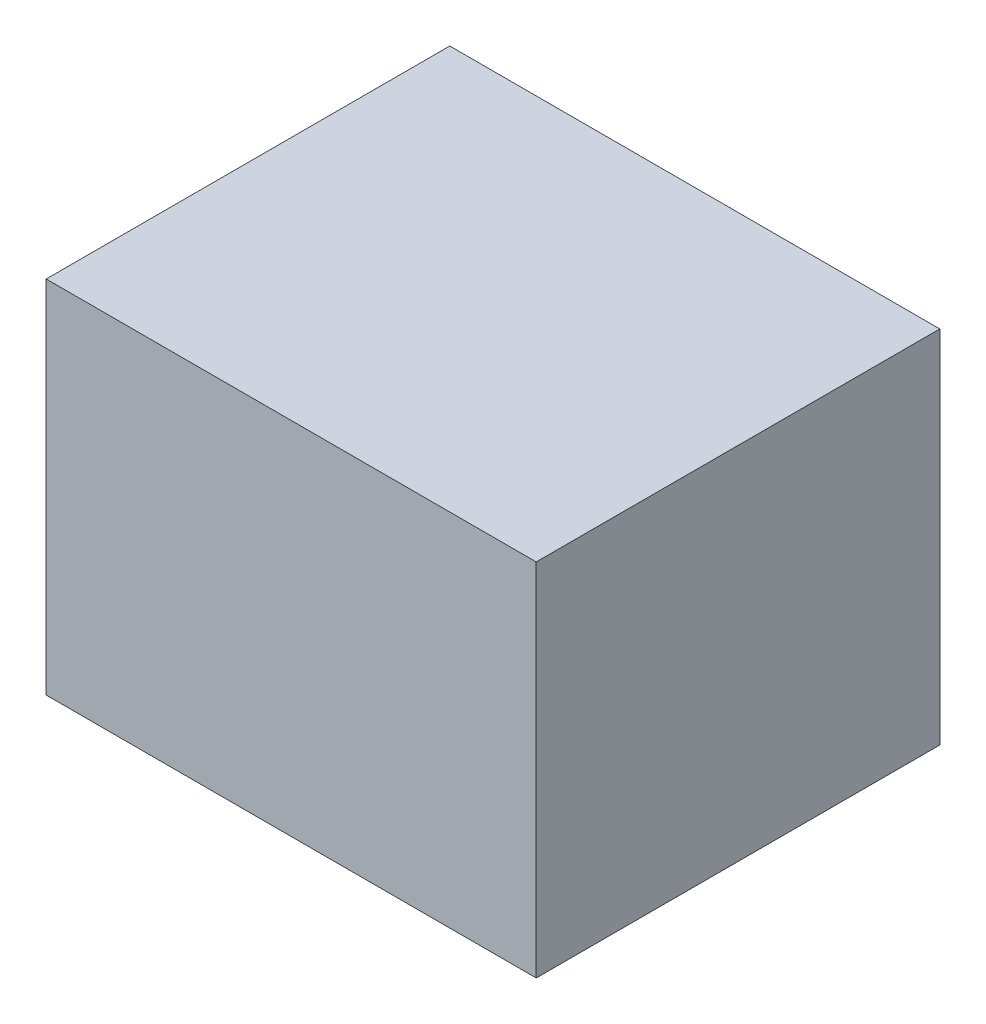
ISO-10303-21;
HEADER;
FILE_DESCRIPTION(('STEP AP214'),'2;1');
FILE_NAME('part.step','',(''),(''),'','','');
FILE_SCHEMA(('AUTOMOTIVE_DESIGN { 1 0 10303 214 1 1 1 1 }'));
ENDSEC;
DATA;
#1=APPLICATION_CONTEXT('core data for automotive mechanical design processes');
#2=APPLICATION_PROTOCOL_DEFINITION('international standard','automotive_design',2000,#1);
#3=PRODUCT_CONTEXT('',#1,'mechanical');
#4=PRODUCT('Part','Part','',(#3));
#5=PRODUCT_RELATED_PRODUCT_CATEGORY('part','',(#4));
#6=PRODUCT_DEFINITION_FORMATION('','',#4);
#7=PRODUCT_DEFINITION_CONTEXT('part definition',#1,'design');
#8=PRODUCT_DEFINITION('design','',#6,#7);
#9=PRODUCT_DEFINITION_SHAPE('','',#8);
#10=(LENGTH_UNIT() NAMED_UNIT(*) SI_UNIT(.MILLI.,.METRE.));
#11=(NAMED_UNIT(*) PLANE_ANGLE_UNIT() SI_UNIT($,.RADIAN.));
#12=(NAMED_UNIT(*) SI_UNIT($,.STERADIAN.) SOLID_ANGLE_UNIT());
#13=UNCERTAINTY_MEASURE_WITH_UNIT(LENGTH_MEASURE(1.E-05),#10,'distance_accuracy_value','');
#14=(GEOMETRIC_REPRESENTATION_CONTEXT(3) GLOBAL_UNCERTAINTY_ASSIGNED_CONTEXT((#13)) GLOBAL_UNIT_ASSIGNED_CONTEXT((#10,
#11,#12)) REPRESENTATION_CONTEXT('',''));
#15=CARTESIAN_POINT('',(0.,0.,0.));
#16=DIRECTION('',(0.,0.,1.));
#17=DIRECTION('',(1.,0.,0.));
#18=AXIS2_PLACEMENT_3D('',#15,#16,#17);
#19=CARTESIAN_POINT('',(170.,250.,-140.));
#20=DIRECTION('',(-1.,0.,0.));
#21=DIRECTION('',(0.,0.,1.));
#22=AXIS2_PLACEMENT_3D('',#19,#20,#21);
#23=PLANE('',#22);
#24=DIRECTION('',(0.,0.,-1.));
#25=VECTOR('',#24,1.);
#26=CARTESIAN_POINT('',(170.,0.,-140.));
#27=LINE('',#26,#25);
#28=CARTESIAN_POINT('',(170.,0.,140.));
#29=VERTEX_POINT('',#28);
#30=CARTESIAN_POINT('',(170.,0.,-140.));
#31=VERTEX_POINT('',#30);
#32=EDGE_CURVE('E97',#29,#31,#27,.T.);
#33=ORIENTED_EDGE('',*,*,#32,.T.);
#34=DIRECTION('',(0.,-1.,0.));
#35=VECTOR('',#34,1.);
#36=CARTESIAN_POINT('',(170.,250.,-140.));
#37=LINE('',#36,#35);
#38=CARTESIAN_POINT('',(170.,250.,-140.));
#39=VERTEX_POINT('',#38);
#40=EDGE_CURVE('E11',#39,#31,#37,.T.);
#41=ORIENTED_EDGE('',*,*,#40,.F.);
#42=DIRECTION('',(0.,0.,-1.));
#43=VECTOR('',#42,1.);
#44=CARTESIAN_POINT('',(170.,250.,-140.));
#45=LINE('',#44,#43);
#46=CARTESIAN_POINT('',(170.,250.,140.));
#47=VERTEX_POINT('',#46);
#48=EDGE_CURVE('E85',#47,#39,#45,.T.);
#49=ORIENTED_EDGE('',*,*,#48,.F.);
#50=DIRECTION('',(0.,-1.,0.));
#51=VECTOR('',#50,1.);
#52=CARTESIAN_POINT('',(170.,250.,140.));
#53=LINE('',#52,#51);
#54=EDGE_CURVE('E93',#47,#29,#53,.T.);
#55=ORIENTED_EDGE('',*,*,#54,.T.);
#56=EDGE_LOOP('',(#33,#41,#49,#55));
#57=FACE_BOUND('',#56,.T.);
#58=ADVANCED_FACE('F34',(#57),#23,.F.);
#59=CARTESIAN_POINT('',(-170.,250.,-140.));
#60=DIRECTION('',(0.,0.,1.));
#61=DIRECTION('',(1.,0.,0.));
#62=AXIS2_PLACEMENT_3D('',#59,#60,#61);
#63=PLANE('',#62);
#64=DIRECTION('',(-1.,0.,0.));
#65=VECTOR('',#64,1.);
#66=CARTESIAN_POINT('',(-170.,0.,-140.));
#67=LINE('',#66,#65);
#68=CARTESIAN_POINT('',(-170.,0.,-140.));
#69=VERTEX_POINT('',#68);
#70=EDGE_CURVE('E89',#31,#69,#67,.T.);
#71=ORIENTED_EDGE('',*,*,#70,.T.);
#72=DIRECTION('',(0.,-1.,0.));
#73=VECTOR('',#72,1.);
#74=CARTESIAN_POINT('',(-170.,250.,-140.));
#75=LINE('',#74,#73);
#76=CARTESIAN_POINT('',(-170.,250.,-140.));
#77=VERTEX_POINT('',#76);
#78=EDGE_CURVE('E42',#77,#69,#75,.T.);
#79=ORIENTED_EDGE('',*,*,#78,.F.);
#80=DIRECTION('',(-1.,0.,0.));
#81=VECTOR('',#80,1.);
#82=CARTESIAN_POINT('',(-170.,250.,-140.));
#83=LINE('',#82,#81);
#84=EDGE_CURVE('E80',#39,#77,#83,.T.);
#85=ORIENTED_EDGE('',*,*,#84,.F.);
#86=ORIENTED_EDGE('',*,*,#40,.T.);
#87=EDGE_LOOP('',(#71,#79,#85,#86));
#88=FACE_BOUND('',#87,.T.);
#89=ADVANCED_FACE('F88',(#88),#63,.F.);
#90=CARTESIAN_POINT('',(-170.,250.,-140.));
#91=DIRECTION('',(1.,0.,0.));
#92=DIRECTION('',(0.,0.,-1.));
#93=AXIS2_PLACEMENT_3D('',#90,#91,#92);
#94=PLANE('',#93);
#95=DIRECTION('',(0.,0.,1.));
#96=VECTOR('',#95,1.);
#97=CARTESIAN_POINT('',(-170.,0.,-140.));
#98=LINE('',#97,#96);
#99=CARTESIAN_POINT('',(-170.,0.,140.));
#100=VERTEX_POINT('',#99);
#101=EDGE_CURVE('E67',#69,#100,#98,.T.);
#102=ORIENTED_EDGE('',*,*,#101,.T.);
#103=DIRECTION('',(0.,-1.,0.));
#104=VECTOR('',#103,1.);
#105=CARTESIAN_POINT('',(-170.,250.,140.));
#106=LINE('',#105,#104);
#107=CARTESIAN_POINT('',(-170.,250.,140.));
#108=VERTEX_POINT('',#107);
#109=EDGE_CURVE('E90',#108,#100,#106,.T.);
#110=ORIENTED_EDGE('',*,*,#109,.F.);
#111=DIRECTION('',(0.,0.,1.));
#112=VECTOR('',#111,1.);
#113=CARTESIAN_POINT('',(-170.,250.,-140.));
#114=LINE('',#113,#112);
#115=EDGE_CURVE('E83',#77,#108,#114,.T.);
#116=ORIENTED_EDGE('',*,*,#115,.F.);
#117=ORIENTED_EDGE('',*,*,#78,.T.);
#118=EDGE_LOOP('',(#102,#110,#116,#117));
#119=FACE_BOUND('',#118,.T.);
#120=ADVANCED_FACE('F91',(#119),#94,.F.);
#121=CARTESIAN_POINT('',(-170.,250.,140.));
#122=DIRECTION('',(0.,0.,-1.));
#123=DIRECTION('',(-1.,0.,0.));
#124=AXIS2_PLACEMENT_3D('',#121,#122,#123);
#125=PLANE('',#124);
#126=DIRECTION('',(1.,0.,0.));
#127=VECTOR('',#126,1.);
#128=CARTESIAN_POINT('',(-170.,0.,140.));
#129=LINE('',#128,#127);
#130=EDGE_CURVE('E73',#100,#29,#129,.T.);
#131=ORIENTED_EDGE('',*,*,#130,.T.);
#132=ORIENTED_EDGE('',*,*,#54,.F.);
#133=DIRECTION('',(1.,0.,0.));
#134=VECTOR('',#133,1.);
#135=CARTESIAN_POINT('',(-170.,250.,140.));
#136=LINE('',#135,#134);
#137=EDGE_CURVE('E50',#108,#47,#136,.T.);
#138=ORIENTED_EDGE('',*,*,#137,.F.);
#139=ORIENTED_EDGE('',*,*,#109,.T.);
#140=EDGE_LOOP('',(#131,#132,#138,#139));
#141=FACE_BOUND('',#140,.T.);
#142=ADVANCED_FACE('F104',(#141),#125,.F.);
#143=CARTESIAN_POINT('',(0.,250.,0.));
#144=DIRECTION('',(0.,1.,0.));
#145=DIRECTION('',(0.,0.,1.));
#146=AXIS2_PLACEMENT_3D('',#143,#144,#145);
#147=PLANE('',#146);
#148=ORIENTED_EDGE('',*,*,#48,.T.);
#149=ORIENTED_EDGE('',*,*,#84,.T.);
#150=ORIENTED_EDGE('',*,*,#115,.T.);
#151=ORIENTED_EDGE('',*,*,#137,.T.);
#152=EDGE_LOOP('',(#148,#149,#150,#151));
#153=FACE_BOUND('',#152,.T.);
#154=ADVANCED_FACE('F81',(#153),#147,.T.);
#155=CARTESIAN_POINT('',(0.,0.,0.));
#156=DIRECTION('',(0.,1.,0.));
#157=DIRECTION('',(0.,0.,1.));
#158=AXIS2_PLACEMENT_3D('',#155,#156,#157);
#159=PLANE('',#158);
#160=ORIENTED_EDGE('',*,*,#32,.F.);
#161=ORIENTED_EDGE('',*,*,#130,.F.);
#162=ORIENTED_EDGE('',*,*,#101,.F.);
#163=ORIENTED_EDGE('',*,*,#70,.F.);
#164=EDGE_LOOP('',(#160,#161,#162,#163));
#165=FACE_BOUND('',#164,.T.);
#166=ADVANCED_FACE('F107',(#165),#159,.F.);
#167=CLOSED_SHELL('',(#58,#89,#120,#142,#154,#166));
#168=MANIFOLD_SOLID_BREP('B2',#167);
#169=ADVANCED_BREP_SHAPE_REPRESENTATION('',(#18,#168),#14);
#170=SHAPE_DEFINITION_REPRESENTATION(#9,#169);
ENDSEC;
END-ISO-10303-21;
